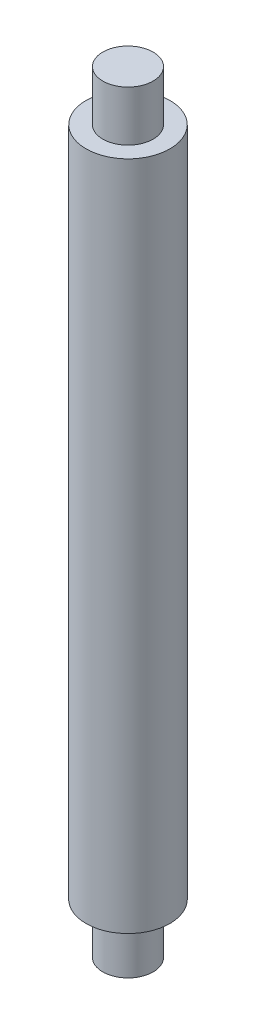
ISO-10303-21;
HEADER;
FILE_DESCRIPTION(('STEP AP214'),'2;1');
FILE_NAME('part.step','',(''),(''),'','','');
FILE_SCHEMA(('AUTOMOTIVE_DESIGN { 1 0 10303 214 1 1 1 1 }'));
ENDSEC;
DATA;
#1=APPLICATION_CONTEXT('core data for automotive mechanical design processes');
#2=APPLICATION_PROTOCOL_DEFINITION('international standard','automotive_design',2000,#1);
#3=PRODUCT_CONTEXT('',#1,'mechanical');
#4=PRODUCT('Part','Part','',(#3));
#5=PRODUCT_RELATED_PRODUCT_CATEGORY('part','',(#4));
#6=PRODUCT_DEFINITION_FORMATION('','',#4);
#7=PRODUCT_DEFINITION_CONTEXT('part definition',#1,'design');
#8=PRODUCT_DEFINITION('design','',#6,#7);
#9=PRODUCT_DEFINITION_SHAPE('','',#8);
#10=(LENGTH_UNIT() NAMED_UNIT(*) SI_UNIT(.MILLI.,.METRE.));
#11=(NAMED_UNIT(*) PLANE_ANGLE_UNIT() SI_UNIT($,.RADIAN.));
#12=(NAMED_UNIT(*) SI_UNIT($,.STERADIAN.) SOLID_ANGLE_UNIT());
#13=UNCERTAINTY_MEASURE_WITH_UNIT(LENGTH_MEASURE(1.E-05),#10,'distance_accuracy_value','');
#14=(GEOMETRIC_REPRESENTATION_CONTEXT(3) GLOBAL_UNCERTAINTY_ASSIGNED_CONTEXT((#13)) GLOBAL_UNIT_ASSIGNED_CONTEXT((#10,
#11,#12)) REPRESENTATION_CONTEXT('',''));
#15=CARTESIAN_POINT('',(0.,0.,0.));
#16=DIRECTION('',(0.,0.,1.));
#17=DIRECTION('',(1.,0.,0.));
#18=AXIS2_PLACEMENT_3D('',#15,#16,#17);
#19=CARTESIAN_POINT('',(0.,-20.,0.));
#20=DIRECTION('',(0.,1.,0.));
#21=DIRECTION('',(0.,0.,1.));
#22=AXIS2_PLACEMENT_3D('',#19,#20,#21);
#23=CYLINDRICAL_SURFACE('',#22,2.5);
#24=CARTESIAN_POINT('',(0.,-20.,0.));
#25=DIRECTION('',(0.,1.,0.));
#26=DIRECTION('',(0.,0.,1.));
#27=AXIS2_PLACEMENT_3D('',#24,#25,#26);
#28=CIRCLE('',#27,2.5);
#29=CARTESIAN_POINT('',(0.,-20.,2.5));
#30=VERTEX_POINT('',#29);
#31=EDGE_CURVE('E50',#30,#30,#28,.T.);
#32=ORIENTED_EDGE('',*,*,#31,.T.);
#33=EDGE_LOOP('',(#32));
#34=FACE_BOUND('',#33,.T.);
#35=CARTESIAN_POINT('',(0.,20.,0.));
#36=DIRECTION('',(0.,1.,0.));
#37=DIRECTION('',(0.,0.,1.));
#38=AXIS2_PLACEMENT_3D('',#35,#36,#37);
#39=CIRCLE('',#38,2.5);
#40=CARTESIAN_POINT('',(0.,20.,2.5));
#41=VERTEX_POINT('',#40);
#42=EDGE_CURVE('E41',#41,#41,#39,.T.);
#43=ORIENTED_EDGE('',*,*,#42,.F.);
#44=EDGE_LOOP('',(#43));
#45=FACE_BOUND('',#44,.T.);
#46=ADVANCED_FACE('F38',(#34,#45),#23,.T.);
#47=CARTESIAN_POINT('',(0.,-20.,0.));
#48=DIRECTION('',(0.,1.,0.));
#49=DIRECTION('',(0.,0.,1.));
#50=AXIS2_PLACEMENT_3D('',#47,#48,#49);
#51=PLANE('',#50);
#52=CARTESIAN_POINT('',(0.,-20.,0.));
#53=DIRECTION('',(0.,-1.,0.));
#54=DIRECTION('',(0.,0.,-1.));
#55=AXIS2_PLACEMENT_3D('',#52,#53,#54);
#56=CIRCLE('',#55,1.5);
#57=CARTESIAN_POINT('',(0.,-20.,-1.5));
#58=VERTEX_POINT('',#57);
#59=EDGE_CURVE('E10',#58,#58,#56,.T.);
#60=ORIENTED_EDGE('',*,*,#59,.F.);
#61=EDGE_LOOP('',(#60));
#62=FACE_BOUND('',#61,.T.);
#63=ORIENTED_EDGE('',*,*,#31,.F.);
#64=EDGE_LOOP('',(#63));
#65=FACE_BOUND('',#64,.T.);
#66=ADVANCED_FACE('F66',(#62,#65),#51,.F.);
#67=CARTESIAN_POINT('',(0.,20.,0.));
#68=DIRECTION('',(0.,1.,0.));
#69=DIRECTION('',(0.,0.,1.));
#70=AXIS2_PLACEMENT_3D('',#67,#68,#69);
#71=PLANE('',#70);
#72=CARTESIAN_POINT('',(0.,20.,0.));
#73=DIRECTION('',(0.,1.,0.));
#74=DIRECTION('',(0.,0.,1.));
#75=AXIS2_PLACEMENT_3D('',#72,#73,#74);
#76=CIRCLE('',#75,1.5);
#77=CARTESIAN_POINT('',(0.,20.,1.5));
#78=VERTEX_POINT('',#77);
#79=EDGE_CURVE('E45',#78,#78,#76,.T.);
#80=ORIENTED_EDGE('',*,*,#79,.F.);
#81=EDGE_LOOP('',(#80));
#82=FACE_BOUND('',#81,.T.);
#83=ORIENTED_EDGE('',*,*,#42,.T.);
#84=EDGE_LOOP('',(#83));
#85=FACE_BOUND('',#84,.T.);
#86=ADVANCED_FACE('F63',(#82,#85),#71,.T.);
#87=CARTESIAN_POINT('',(0.,23.,0.));
#88=DIRECTION('',(0.,-1.,0.));
#89=DIRECTION('',(0.,0.,-1.));
#90=AXIS2_PLACEMENT_3D('',#87,#88,#89);
#91=CYLINDRICAL_SURFACE('',#90,1.5);
#92=CARTESIAN_POINT('',(0.,23.,0.));
#93=DIRECTION('',(0.,1.,0.));
#94=DIRECTION('',(0.,0.,1.));
#95=AXIS2_PLACEMENT_3D('',#92,#93,#94);
#96=CIRCLE('',#95,1.5);
#97=CARTESIAN_POINT('',(0.,23.,1.5));
#98=VERTEX_POINT('',#97);
#99=EDGE_CURVE('E55',#98,#98,#96,.T.);
#100=ORIENTED_EDGE('',*,*,#99,.F.);
#101=EDGE_LOOP('',(#100));
#102=FACE_BOUND('',#101,.T.);
#103=ORIENTED_EDGE('',*,*,#79,.T.);
#104=EDGE_LOOP('',(#103));
#105=FACE_BOUND('',#104,.T.);
#106=ADVANCED_FACE('F75',(#102,#105),#91,.T.);
#107=CARTESIAN_POINT('',(0.,23.,0.));
#108=DIRECTION('',(0.,1.,0.));
#109=DIRECTION('',(0.,0.,1.));
#110=AXIS2_PLACEMENT_3D('',#107,#108,#109);
#111=PLANE('',#110);
#112=ORIENTED_EDGE('',*,*,#99,.T.);
#113=EDGE_LOOP('',(#112));
#114=FACE_BOUND('',#113,.T.);
#115=ADVANCED_FACE('F81',(#114),#111,.T.);
#116=CARTESIAN_POINT('',(0.,-23.,0.));
#117=DIRECTION('',(0.,1.,0.));
#118=DIRECTION('',(0.,0.,1.));
#119=AXIS2_PLACEMENT_3D('',#116,#117,#118);
#120=CYLINDRICAL_SURFACE('',#119,1.5);
#121=CARTESIAN_POINT('',(0.,-23.,0.));
#122=DIRECTION('',(0.,-1.,0.));
#123=DIRECTION('',(0.,0.,-1.));
#124=AXIS2_PLACEMENT_3D('',#121,#122,#123);
#125=CIRCLE('',#124,1.5);
#126=CARTESIAN_POINT('',(0.,-23.,-1.5));
#127=VERTEX_POINT('',#126);
#128=EDGE_CURVE('E54',#127,#127,#125,.T.);
#129=ORIENTED_EDGE('',*,*,#128,.F.);
#130=EDGE_LOOP('',(#129));
#131=FACE_BOUND('',#130,.T.);
#132=ORIENTED_EDGE('',*,*,#59,.T.);
#133=EDGE_LOOP('',(#132));
#134=FACE_BOUND('',#133,.T.);
#135=ADVANCED_FACE('F85',(#131,#134),#120,.T.);
#136=CARTESIAN_POINT('',(0.,-23.,0.));
#137=DIRECTION('',(0.,-1.,0.));
#138=DIRECTION('',(0.,0.,-1.));
#139=AXIS2_PLACEMENT_3D('',#136,#137,#138);
#140=PLANE('',#139);
#141=ORIENTED_EDGE('',*,*,#128,.T.);
#142=EDGE_LOOP('',(#141));
#143=FACE_BOUND('',#142,.T.);
#144=ADVANCED_FACE('F89',(#143),#140,.T.);
#145=CLOSED_SHELL('',(#46,#66,#86,#106,#115,#135,#144));
#146=MANIFOLD_SOLID_BREP('B2',#145);
#147=ADVANCED_BREP_SHAPE_REPRESENTATION('',(#18,#146),#14);
#148=SHAPE_DEFINITION_REPRESENTATION(#9,#147);
ENDSEC;
END-ISO-10303-21;
